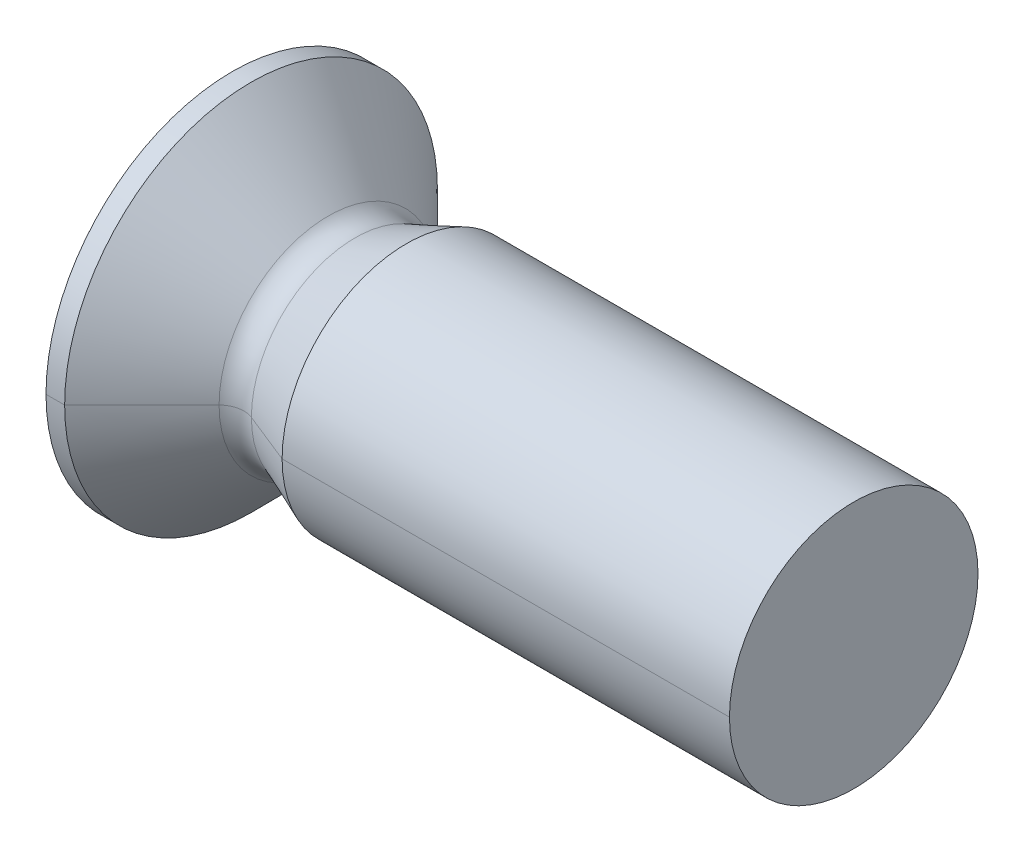
ISO-10303-21;
HEADER;
FILE_DESCRIPTION(('STEP AP214'),'2;1');
FILE_NAME('part.step','',(''),(''),'','','');
FILE_SCHEMA(('AUTOMOTIVE_DESIGN { 1 0 10303 214 1 1 1 1 }'));
ENDSEC;
DATA;
#1=APPLICATION_CONTEXT('core data for automotive mechanical design processes');
#2=APPLICATION_PROTOCOL_DEFINITION('international standard','automotive_design',2000,#1);
#3=PRODUCT_CONTEXT('',#1,'mechanical');
#4=PRODUCT('Part','Part','',(#3));
#5=PRODUCT_RELATED_PRODUCT_CATEGORY('part','',(#4));
#6=PRODUCT_DEFINITION_FORMATION('','',#4);
#7=PRODUCT_DEFINITION_CONTEXT('part definition',#1,'design');
#8=PRODUCT_DEFINITION('design','',#6,#7);
#9=PRODUCT_DEFINITION_SHAPE('','',#8);
#10=(LENGTH_UNIT() NAMED_UNIT(*) SI_UNIT(.MILLI.,.METRE.));
#11=(NAMED_UNIT(*) PLANE_ANGLE_UNIT() SI_UNIT($,.RADIAN.));
#12=(NAMED_UNIT(*) SI_UNIT($,.STERADIAN.) SOLID_ANGLE_UNIT());
#13=UNCERTAINTY_MEASURE_WITH_UNIT(LENGTH_MEASURE(1.E-05),#10,'distance_accuracy_value','');
#14=(GEOMETRIC_REPRESENTATION_CONTEXT(3) GLOBAL_UNCERTAINTY_ASSIGNED_CONTEXT((#13)) GLOBAL_UNIT_ASSIGNED_CONTEXT((#10,
#11,#12)) REPRESENTATION_CONTEXT('',''));
#15=CARTESIAN_POINT('',(0.,0.,0.));
#16=DIRECTION('',(0.,0.,1.));
#17=DIRECTION('',(1.,0.,0.));
#18=AXIS2_PLACEMENT_3D('',#15,#16,#17);
#19=CARTESIAN_POINT('',(-1.4,0.,0.));
#20=DIRECTION('',(1.,0.,0.));
#21=DIRECTION('',(0.,0.,-1.));
#22=AXIS2_PLACEMENT_3D('',#19,#20,#21);
#23=PLANE('',#22);
#24=CARTESIAN_POINT('',(-1.4,0.,0.));
#25=DIRECTION('',(1.,0.,0.));
#26=DIRECTION('',(0.,0.,-1.));
#27=AXIS2_PLACEMENT_3D('',#24,#25,#26);
#28=CIRCLE('',#27,3.);
#29=CARTESIAN_POINT('',(-1.4,0.,-3.));
#30=VERTEX_POINT('',#29);
#31=CARTESIAN_POINT('',(-1.4,0.,3.));
#32=VERTEX_POINT('',#31);
#33=EDGE_CURVE('E11',#30,#32,#28,.T.);
#34=ORIENTED_EDGE('',*,*,#33,.F.);
#35=CARTESIAN_POINT('',(-1.4,0.,0.));
#36=DIRECTION('',(1.,0.,0.));
#37=DIRECTION('',(0.,0.,-1.));
#38=AXIS2_PLACEMENT_3D('',#35,#36,#37);
#39=CIRCLE('',#38,3.);
#40=EDGE_CURVE('E25',#32,#30,#39,.T.);
#41=ORIENTED_EDGE('',*,*,#40,.F.);
#42=EDGE_LOOP('',(#34,#41));
#43=FACE_BOUND('',#42,.T.);
#44=DIRECTION('',(0.,0.,-1.));
#45=VECTOR('',#44,1.);
#46=CARTESIAN_POINT('',(-1.4,-0.4,2.25));
#47=LINE('',#46,#45);
#48=CARTESIAN_POINT('',(-1.4,-0.4,2.25));
#49=VERTEX_POINT('',#48);
#50=CARTESIAN_POINT('',(-1.4,-0.4,1.));
#51=VERTEX_POINT('',#50);
#52=EDGE_CURVE('E523',#49,#51,#47,.T.);
#53=ORIENTED_EDGE('',*,*,#52,.T.);
#54=CARTESIAN_POINT('',(-1.4,-0.999999999999995,0.999999999999995));
#55=DIRECTION('',(1.,0.,0.));
#56=DIRECTION('',(0.,0.,-1.));
#57=AXIS2_PLACEMENT_3D('',#54,#55,#56);
#58=CIRCLE('',#57,0.6);
#59=CARTESIAN_POINT('',(-1.4,-1.,0.4));
#60=VERTEX_POINT('',#59);
#61=EDGE_CURVE('E518',#60,#51,#58,.T.);
#62=ORIENTED_EDGE('',*,*,#61,.F.);
#63=DIRECTION('',(0.,-1.,0.));
#64=VECTOR('',#63,1.);
#65=CARTESIAN_POINT('',(-1.4,-1.,0.4));
#66=LINE('',#65,#64);
#67=CARTESIAN_POINT('',(-1.4,-2.25,0.4));
#68=VERTEX_POINT('',#67);
#69=EDGE_CURVE('E514',#60,#68,#66,.T.);
#70=ORIENTED_EDGE('',*,*,#69,.T.);
#71=DIRECTION('',(0.,0.,-1.));
#72=VECTOR('',#71,1.);
#73=CARTESIAN_POINT('',(-1.4,-2.25,0.4));
#74=LINE('',#73,#72);
#75=CARTESIAN_POINT('',(-1.4,-2.25,-0.4));
#76=VERTEX_POINT('',#75);
#77=EDGE_CURVE('E510',#68,#76,#74,.T.);
#78=ORIENTED_EDGE('',*,*,#77,.T.);
#79=DIRECTION('',(0.,1.,0.));
#80=VECTOR('',#79,1.);
#81=CARTESIAN_POINT('',(-1.4,-2.25,-0.4));
#82=LINE('',#81,#80);
#83=CARTESIAN_POINT('',(-1.4,-1.,-0.4));
#84=VERTEX_POINT('',#83);
#85=EDGE_CURVE('E506',#76,#84,#82,.T.);
#86=ORIENTED_EDGE('',*,*,#85,.T.);
#87=CARTESIAN_POINT('',(-1.4,-0.999999999999995,-0.999999999999995));
#88=DIRECTION('',(1.,0.,0.));
#89=DIRECTION('',(0.,0.,-1.));
#90=AXIS2_PLACEMENT_3D('',#87,#88,#89);
#91=CIRCLE('',#90,0.6);
#92=CARTESIAN_POINT('',(-1.4,-0.4,-1.));
#93=VERTEX_POINT('',#92);
#94=EDGE_CURVE('E501',#93,#84,#91,.T.);
#95=ORIENTED_EDGE('',*,*,#94,.F.);
#96=DIRECTION('',(0.,0.,-1.));
#97=VECTOR('',#96,1.);
#98=CARTESIAN_POINT('',(-1.4,-0.4,-1.));
#99=LINE('',#98,#97);
#100=CARTESIAN_POINT('',(-1.4,-0.4,-2.25));
#101=VERTEX_POINT('',#100);
#102=EDGE_CURVE('E497',#93,#101,#99,.T.);
#103=ORIENTED_EDGE('',*,*,#102,.T.);
#104=DIRECTION('',(0.,1.,0.));
#105=VECTOR('',#104,1.);
#106=CARTESIAN_POINT('',(-1.4,-0.4,-2.25));
#107=LINE('',#106,#105);
#108=CARTESIAN_POINT('',(-1.4,0.4,-2.25));
#109=VERTEX_POINT('',#108);
#110=EDGE_CURVE('E493',#101,#109,#107,.T.);
#111=ORIENTED_EDGE('',*,*,#110,.T.);
#112=DIRECTION('',(0.,0.,1.));
#113=VECTOR('',#112,1.);
#114=CARTESIAN_POINT('',(-1.4,0.4,-2.25));
#115=LINE('',#114,#113);
#116=CARTESIAN_POINT('',(-1.4,0.4,-1.));
#117=VERTEX_POINT('',#116);
#118=EDGE_CURVE('E489',#109,#117,#115,.T.);
#119=ORIENTED_EDGE('',*,*,#118,.T.);
#120=CARTESIAN_POINT('',(-1.4,0.999999999999995,-0.999999999999995));
#121=DIRECTION('',(1.,0.,0.));
#122=DIRECTION('',(0.,0.,-1.));
#123=AXIS2_PLACEMENT_3D('',#120,#121,#122);
#124=CIRCLE('',#123,0.6);
#125=CARTESIAN_POINT('',(-1.4,1.,-0.4));
#126=VERTEX_POINT('',#125);
#127=EDGE_CURVE('E484',#126,#117,#124,.T.);
#128=ORIENTED_EDGE('',*,*,#127,.F.);
#129=DIRECTION('',(0.,1.,0.));
#130=VECTOR('',#129,1.);
#131=CARTESIAN_POINT('',(-1.4,1.,-0.4));
#132=LINE('',#131,#130);
#133=CARTESIAN_POINT('',(-1.4,2.25,-0.4));
#134=VERTEX_POINT('',#133);
#135=EDGE_CURVE('E480',#126,#134,#132,.T.);
#136=ORIENTED_EDGE('',*,*,#135,.T.);
#137=DIRECTION('',(0.,0.,-1.));
#138=VECTOR('',#137,1.);
#139=CARTESIAN_POINT('',(-1.4,2.25,0.));
#140=LINE('',#139,#138);
#141=CARTESIAN_POINT('',(-1.4,2.25,0.4));
#142=VERTEX_POINT('',#141);
#143=EDGE_CURVE('E475',#142,#134,#140,.T.);
#144=ORIENTED_EDGE('',*,*,#143,.F.);
#145=DIRECTION('',(0.,-1.,0.));
#146=VECTOR('',#145,1.);
#147=CARTESIAN_POINT('',(-1.4,2.25,0.4));
#148=LINE('',#147,#146);
#149=CARTESIAN_POINT('',(-1.4,1.,0.4));
#150=VERTEX_POINT('',#149);
#151=EDGE_CURVE('E471',#142,#150,#148,.T.);
#152=ORIENTED_EDGE('',*,*,#151,.T.);
#153=CARTESIAN_POINT('',(-1.4,0.999999999999995,0.999999999999995));
#154=DIRECTION('',(1.,0.,0.));
#155=DIRECTION('',(0.,0.,-1.));
#156=AXIS2_PLACEMENT_3D('',#153,#154,#155);
#157=CIRCLE('',#156,0.6);
#158=CARTESIAN_POINT('',(-1.4,0.4,1.));
#159=VERTEX_POINT('',#158);
#160=EDGE_CURVE('E466',#159,#150,#157,.T.);
#161=ORIENTED_EDGE('',*,*,#160,.F.);
#162=DIRECTION('',(0.,0.,1.));
#163=VECTOR('',#162,1.);
#164=CARTESIAN_POINT('',(-1.4,0.4,1.));
#165=LINE('',#164,#163);
#166=CARTESIAN_POINT('',(-1.4,0.4,2.25));
#167=VERTEX_POINT('',#166);
#168=EDGE_CURVE('E462',#159,#167,#165,.T.);
#169=ORIENTED_EDGE('',*,*,#168,.T.);
#170=DIRECTION('',(0.,-1.,0.));
#171=VECTOR('',#170,1.);
#172=CARTESIAN_POINT('',(-1.4,0.4,2.25));
#173=LINE('',#172,#171);
#174=EDGE_CURVE('E458',#167,#49,#173,.T.);
#175=ORIENTED_EDGE('',*,*,#174,.T.);
#176=EDGE_LOOP('',(#53,#62,#70,#78,#86,#95,#103,#111,#119,#128,#136,#144,#152,#161,#169,#175));
#177=FACE_BOUND('',#176,.T.);
#178=ADVANCED_FACE('F17',(#43,#177),#23,.F.);
#179=CARTESIAN_POINT('',(-0.7,0.4,2.25));
#180=DIRECTION('',(0.,0.,-1.));
#181=DIRECTION('',(-1.,0.,0.));
#182=AXIS2_PLACEMENT_3D('',#179,#180,#181);
#183=PLANE('',#182);
#184=ORIENTED_EDGE('',*,*,#174,.F.);
#185=DIRECTION('',(-1.,0.,0.));
#186=VECTOR('',#185,1.);
#187=CARTESIAN_POINT('',(-0.7,0.4,2.25));
#188=LINE('',#187,#186);
#189=CARTESIAN_POINT('',(-0.7,0.4,2.25));
#190=VERTEX_POINT('',#189);
#191=EDGE_CURVE('E453',#190,#167,#188,.T.);
#192=ORIENTED_EDGE('',*,*,#191,.F.);
#193=DIRECTION('',(0.,-1.,0.));
#194=VECTOR('',#193,1.);
#195=CARTESIAN_POINT('',(-0.7,0.4,2.25));
#196=LINE('',#195,#194);
#197=CARTESIAN_POINT('',(-0.7,-0.4,2.25));
#198=VERTEX_POINT('',#197);
#199=EDGE_CURVE('E449',#190,#198,#196,.T.);
#200=ORIENTED_EDGE('',*,*,#199,.T.);
#201=DIRECTION('',(-1.,0.,0.));
#202=VECTOR('',#201,1.);
#203=CARTESIAN_POINT('',(-0.7,-0.4,2.25));
#204=LINE('',#203,#202);
#205=EDGE_CURVE('E444',#198,#49,#204,.T.);
#206=ORIENTED_EDGE('',*,*,#205,.T.);
#207=EDGE_LOOP('',(#184,#192,#200,#206));
#208=FACE_BOUND('',#207,.T.);
#209=ADVANCED_FACE('F557',(#208),#183,.T.);
#210=CARTESIAN_POINT('',(-0.7,-0.4,2.25));
#211=DIRECTION('',(0.,1.,0.));
#212=DIRECTION('',(0.,0.,1.));
#213=AXIS2_PLACEMENT_3D('',#210,#211,#212);
#214=PLANE('',#213);
#215=ORIENTED_EDGE('',*,*,#52,.F.);
#216=ORIENTED_EDGE('',*,*,#205,.F.);
#217=DIRECTION('',(0.,0.,-1.));
#218=VECTOR('',#217,1.);
#219=CARTESIAN_POINT('',(-0.7,-0.4,2.25));
#220=LINE('',#219,#218);
#221=CARTESIAN_POINT('',(-0.7,-0.4,1.));
#222=VERTEX_POINT('',#221);
#223=EDGE_CURVE('E440',#198,#222,#220,.T.);
#224=ORIENTED_EDGE('',*,*,#223,.T.);
#225=DIRECTION('',(-1.,0.,0.));
#226=VECTOR('',#225,1.);
#227=CARTESIAN_POINT('',(-0.7,-0.4,1.));
#228=LINE('',#227,#226);
#229=EDGE_CURVE('E435',#222,#51,#228,.T.);
#230=ORIENTED_EDGE('',*,*,#229,.T.);
#231=EDGE_LOOP('',(#215,#216,#224,#230));
#232=FACE_BOUND('',#231,.T.);
#233=ADVANCED_FACE('F561',(#232),#214,.T.);
#234=CARTESIAN_POINT('',(-0.7,-0.999999999999995,0.999999999999995));
#235=DIRECTION('',(1.,0.,0.));
#236=DIRECTION('',(0.,-0.707106781186548,0.707106781186547));
#237=AXIS2_PLACEMENT_3D('',#234,#235,#236);
#238=CYLINDRICAL_SURFACE('',#237,0.6);
#239=ORIENTED_EDGE('',*,*,#61,.T.);
#240=ORIENTED_EDGE('',*,*,#229,.F.);
#241=CARTESIAN_POINT('',(-0.7,-0.999999999999995,0.999999999999995));
#242=DIRECTION('',(1.,0.,0.));
#243=DIRECTION('',(0.,0.,-1.));
#244=AXIS2_PLACEMENT_3D('',#241,#242,#243);
#245=CIRCLE('',#244,0.6);
#246=CARTESIAN_POINT('',(-0.7,-1.,0.4));
#247=VERTEX_POINT('',#246);
#248=EDGE_CURVE('E430',#247,#222,#245,.T.);
#249=ORIENTED_EDGE('',*,*,#248,.F.);
#250=DIRECTION('',(-1.,0.,0.));
#251=VECTOR('',#250,1.);
#252=CARTESIAN_POINT('',(-0.7,-1.,0.4));
#253=LINE('',#252,#251);
#254=EDGE_CURVE('E425',#247,#60,#253,.T.);
#255=ORIENTED_EDGE('',*,*,#254,.T.);
#256=EDGE_LOOP('',(#239,#240,#249,#255));
#257=FACE_BOUND('',#256,.T.);
#258=ADVANCED_FACE('F571',(#257),#238,.T.);
#259=CARTESIAN_POINT('',(-0.7,-1.,0.4));
#260=DIRECTION('',(0.,0.,-1.));
#261=DIRECTION('',(-1.,0.,0.));
#262=AXIS2_PLACEMENT_3D('',#259,#260,#261);
#263=PLANE('',#262);
#264=ORIENTED_EDGE('',*,*,#69,.F.);
#265=ORIENTED_EDGE('',*,*,#254,.F.);
#266=DIRECTION('',(0.,-1.,0.));
#267=VECTOR('',#266,1.);
#268=CARTESIAN_POINT('',(-0.7,-1.,0.4));
#269=LINE('',#268,#267);
#270=CARTESIAN_POINT('',(-0.7,-2.25,0.4));
#271=VERTEX_POINT('',#270);
#272=EDGE_CURVE('E421',#247,#271,#269,.T.);
#273=ORIENTED_EDGE('',*,*,#272,.T.);
#274=DIRECTION('',(-1.,0.,0.));
#275=VECTOR('',#274,1.);
#276=CARTESIAN_POINT('',(-0.7,-2.25,0.4));
#277=LINE('',#276,#275);
#278=EDGE_CURVE('E416',#271,#68,#277,.T.);
#279=ORIENTED_EDGE('',*,*,#278,.T.);
#280=EDGE_LOOP('',(#264,#265,#273,#279));
#281=FACE_BOUND('',#280,.T.);
#282=ADVANCED_FACE('F576',(#281),#263,.T.);
#283=CARTESIAN_POINT('',(-0.7,-2.25,0.4));
#284=DIRECTION('',(0.,1.,0.));
#285=DIRECTION('',(0.,0.,1.));
#286=AXIS2_PLACEMENT_3D('',#283,#284,#285);
#287=PLANE('',#286);
#288=ORIENTED_EDGE('',*,*,#77,.F.);
#289=ORIENTED_EDGE('',*,*,#278,.F.);
#290=DIRECTION('',(0.,0.,-1.));
#291=VECTOR('',#290,1.);
#292=CARTESIAN_POINT('',(-0.7,-2.25,0.4));
#293=LINE('',#292,#291);
#294=CARTESIAN_POINT('',(-0.7,-2.25,-0.4));
#295=VERTEX_POINT('',#294);
#296=EDGE_CURVE('E412',#271,#295,#293,.T.);
#297=ORIENTED_EDGE('',*,*,#296,.T.);
#298=DIRECTION('',(-1.,0.,0.));
#299=VECTOR('',#298,1.);
#300=CARTESIAN_POINT('',(-0.7,-2.25,-0.4));
#301=LINE('',#300,#299);
#302=EDGE_CURVE('E407',#295,#76,#301,.T.);
#303=ORIENTED_EDGE('',*,*,#302,.T.);
#304=EDGE_LOOP('',(#288,#289,#297,#303));
#305=FACE_BOUND('',#304,.T.);
#306=ADVANCED_FACE('F582',(#305),#287,.T.);
#307=CARTESIAN_POINT('',(-0.7,-2.25,-0.4));
#308=DIRECTION('',(0.,0.,1.));
#309=DIRECTION('',(1.,0.,0.));
#310=AXIS2_PLACEMENT_3D('',#307,#308,#309);
#311=PLANE('',#310);
#312=ORIENTED_EDGE('',*,*,#85,.F.);
#313=ORIENTED_EDGE('',*,*,#302,.F.);
#314=DIRECTION('',(0.,1.,0.));
#315=VECTOR('',#314,1.);
#316=CARTESIAN_POINT('',(-0.7,-2.25,-0.4));
#317=LINE('',#316,#315);
#318=CARTESIAN_POINT('',(-0.7,-1.,-0.4));
#319=VERTEX_POINT('',#318);
#320=EDGE_CURVE('E403',#295,#319,#317,.T.);
#321=ORIENTED_EDGE('',*,*,#320,.T.);
#322=DIRECTION('',(-1.,0.,0.));
#323=VECTOR('',#322,1.);
#324=CARTESIAN_POINT('',(-0.7,-1.,-0.4));
#325=LINE('',#324,#323);
#326=EDGE_CURVE('E398',#319,#84,#325,.T.);
#327=ORIENTED_EDGE('',*,*,#326,.T.);
#328=EDGE_LOOP('',(#312,#313,#321,#327));
#329=FACE_BOUND('',#328,.T.);
#330=ADVANCED_FACE('F586',(#329),#311,.T.);
#331=CARTESIAN_POINT('',(-0.7,-0.999999999999995,-0.999999999999995));
#332=DIRECTION('',(1.,0.,0.));
#333=DIRECTION('',(0.,-0.707106781186548,-0.707106781186547));
#334=AXIS2_PLACEMENT_3D('',#331,#332,#333);
#335=CYLINDRICAL_SURFACE('',#334,0.6);
#336=ORIENTED_EDGE('',*,*,#94,.T.);
#337=ORIENTED_EDGE('',*,*,#326,.F.);
#338=CARTESIAN_POINT('',(-0.7,-0.999999999999995,-0.999999999999995));
#339=DIRECTION('',(1.,0.,0.));
#340=DIRECTION('',(0.,0.,-1.));
#341=AXIS2_PLACEMENT_3D('',#338,#339,#340);
#342=CIRCLE('',#341,0.6);
#343=CARTESIAN_POINT('',(-0.7,-0.4,-1.));
#344=VERTEX_POINT('',#343);
#345=EDGE_CURVE('E393',#344,#319,#342,.T.);
#346=ORIENTED_EDGE('',*,*,#345,.F.);
#347=DIRECTION('',(-1.,0.,0.));
#348=VECTOR('',#347,1.);
#349=CARTESIAN_POINT('',(-0.7,-0.4,-1.));
#350=LINE('',#349,#348);
#351=EDGE_CURVE('E388',#344,#93,#350,.T.);
#352=ORIENTED_EDGE('',*,*,#351,.T.);
#353=EDGE_LOOP('',(#336,#337,#346,#352));
#354=FACE_BOUND('',#353,.T.);
#355=ADVANCED_FACE('F589',(#354),#335,.T.);
#356=CARTESIAN_POINT('',(-0.7,-0.4,-1.));
#357=DIRECTION('',(0.,1.,0.));
#358=DIRECTION('',(0.,0.,1.));
#359=AXIS2_PLACEMENT_3D('',#356,#357,#358);
#360=PLANE('',#359);
#361=ORIENTED_EDGE('',*,*,#102,.F.);
#362=ORIENTED_EDGE('',*,*,#351,.F.);
#363=DIRECTION('',(0.,0.,-1.));
#364=VECTOR('',#363,1.);
#365=CARTESIAN_POINT('',(-0.7,-0.4,-1.));
#366=LINE('',#365,#364);
#367=CARTESIAN_POINT('',(-0.7,-0.4,-2.25));
#368=VERTEX_POINT('',#367);
#369=EDGE_CURVE('E384',#344,#368,#366,.T.);
#370=ORIENTED_EDGE('',*,*,#369,.T.);
#371=DIRECTION('',(-1.,0.,0.));
#372=VECTOR('',#371,1.);
#373=CARTESIAN_POINT('',(-0.7,-0.4,-2.25));
#374=LINE('',#373,#372);
#375=EDGE_CURVE('E379',#368,#101,#374,.T.);
#376=ORIENTED_EDGE('',*,*,#375,.T.);
#377=EDGE_LOOP('',(#361,#362,#370,#376));
#378=FACE_BOUND('',#377,.T.);
#379=ADVANCED_FACE('F595',(#378),#360,.T.);
#380=CARTESIAN_POINT('',(-0.7,-0.4,-2.25));
#381=DIRECTION('',(0.,0.,1.));
#382=DIRECTION('',(1.,0.,0.));
#383=AXIS2_PLACEMENT_3D('',#380,#381,#382);
#384=PLANE('',#383);
#385=ORIENTED_EDGE('',*,*,#110,.F.);
#386=ORIENTED_EDGE('',*,*,#375,.F.);
#387=DIRECTION('',(0.,1.,0.));
#388=VECTOR('',#387,1.);
#389=CARTESIAN_POINT('',(-0.7,-0.4,-2.25));
#390=LINE('',#389,#388);
#391=CARTESIAN_POINT('',(-0.7,0.4,-2.25));
#392=VERTEX_POINT('',#391);
#393=EDGE_CURVE('E375',#368,#392,#390,.T.);
#394=ORIENTED_EDGE('',*,*,#393,.T.);
#395=DIRECTION('',(-1.,0.,0.));
#396=VECTOR('',#395,1.);
#397=CARTESIAN_POINT('',(-0.7,0.4,-2.25));
#398=LINE('',#397,#396);
#399=EDGE_CURVE('E370',#392,#109,#398,.T.);
#400=ORIENTED_EDGE('',*,*,#399,.T.);
#401=EDGE_LOOP('',(#385,#386,#394,#400));
#402=FACE_BOUND('',#401,.T.);
#403=ADVANCED_FACE('F599',(#402),#384,.T.);
#404=CARTESIAN_POINT('',(-0.7,0.4,-2.25));
#405=DIRECTION('',(0.,-1.,0.));
#406=DIRECTION('',(0.,0.,-1.));
#407=AXIS2_PLACEMENT_3D('',#404,#405,#406);
#408=PLANE('',#407);
#409=ORIENTED_EDGE('',*,*,#118,.F.);
#410=ORIENTED_EDGE('',*,*,#399,.F.);
#411=DIRECTION('',(0.,0.,1.));
#412=VECTOR('',#411,1.);
#413=CARTESIAN_POINT('',(-0.7,0.4,-2.25));
#414=LINE('',#413,#412);
#415=CARTESIAN_POINT('',(-0.7,0.4,-1.));
#416=VERTEX_POINT('',#415);
#417=EDGE_CURVE('E366',#392,#416,#414,.T.);
#418=ORIENTED_EDGE('',*,*,#417,.T.);
#419=DIRECTION('',(-1.,0.,0.));
#420=VECTOR('',#419,1.);
#421=CARTESIAN_POINT('',(-0.7,0.4,-1.));
#422=LINE('',#421,#420);
#423=EDGE_CURVE('E361',#416,#117,#422,.T.);
#424=ORIENTED_EDGE('',*,*,#423,.T.);
#425=EDGE_LOOP('',(#409,#410,#418,#424));
#426=FACE_BOUND('',#425,.T.);
#427=ADVANCED_FACE('F604',(#426),#408,.T.);
#428=CARTESIAN_POINT('',(-0.7,0.999999999999995,-0.999999999999995));
#429=DIRECTION('',(1.,0.,0.));
#430=DIRECTION('',(0.,0.707106781186553,-0.707106781186542));
#431=AXIS2_PLACEMENT_3D('',#428,#429,#430);
#432=CYLINDRICAL_SURFACE('',#431,0.6);
#433=ORIENTED_EDGE('',*,*,#127,.T.);
#434=ORIENTED_EDGE('',*,*,#423,.F.);
#435=CARTESIAN_POINT('',(-0.7,0.999999999999995,-0.999999999999995));
#436=DIRECTION('',(1.,0.,0.));
#437=DIRECTION('',(0.,0.,-1.));
#438=AXIS2_PLACEMENT_3D('',#435,#436,#437);
#439=CIRCLE('',#438,0.6);
#440=CARTESIAN_POINT('',(-0.7,1.,-0.4));
#441=VERTEX_POINT('',#440);
#442=EDGE_CURVE('E356',#441,#416,#439,.T.);
#443=ORIENTED_EDGE('',*,*,#442,.F.);
#444=DIRECTION('',(-1.,0.,0.));
#445=VECTOR('',#444,1.);
#446=CARTESIAN_POINT('',(-0.7,1.,-0.4));
#447=LINE('',#446,#445);
#448=EDGE_CURVE('E351',#441,#126,#447,.T.);
#449=ORIENTED_EDGE('',*,*,#448,.T.);
#450=EDGE_LOOP('',(#433,#434,#443,#449));
#451=FACE_BOUND('',#450,.T.);
#452=ADVANCED_FACE('F609',(#451),#432,.T.);
#453=CARTESIAN_POINT('',(-0.7,1.,-0.4));
#454=DIRECTION('',(0.,0.,1.));
#455=DIRECTION('',(1.,0.,0.));
#456=AXIS2_PLACEMENT_3D('',#453,#454,#455);
#457=PLANE('',#456);
#458=ORIENTED_EDGE('',*,*,#135,.F.);
#459=ORIENTED_EDGE('',*,*,#448,.F.);
#460=DIRECTION('',(0.,1.,0.));
#461=VECTOR('',#460,1.);
#462=CARTESIAN_POINT('',(-0.7,1.,-0.4));
#463=LINE('',#462,#461);
#464=CARTESIAN_POINT('',(-0.7,2.25,-0.4));
#465=VERTEX_POINT('',#464);
#466=EDGE_CURVE('E347',#441,#465,#463,.T.);
#467=ORIENTED_EDGE('',*,*,#466,.T.);
#468=DIRECTION('',(-1.,0.,0.));
#469=VECTOR('',#468,1.);
#470=CARTESIAN_POINT('',(-0.7,2.25,-0.4));
#471=LINE('',#470,#469);
#472=EDGE_CURVE('E342',#465,#134,#471,.T.);
#473=ORIENTED_EDGE('',*,*,#472,.T.);
#474=EDGE_LOOP('',(#458,#459,#467,#473));
#475=FACE_BOUND('',#474,.T.);
#476=ADVANCED_FACE('F612',(#475),#457,.T.);
#477=CARTESIAN_POINT('',(-0.7,2.25,-0.4));
#478=DIRECTION('',(0.,-1.,0.));
#479=DIRECTION('',(0.,0.,-1.));
#480=AXIS2_PLACEMENT_3D('',#477,#478,#479);
#481=PLANE('',#480);
#482=ORIENTED_EDGE('',*,*,#143,.T.);
#483=ORIENTED_EDGE('',*,*,#472,.F.);
#484=DIRECTION('',(0.,0.,1.));
#485=VECTOR('',#484,1.);
#486=CARTESIAN_POINT('',(-0.7,2.25,-0.4));
#487=LINE('',#486,#485);
#488=CARTESIAN_POINT('',(-0.7,2.25,0.4));
#489=VERTEX_POINT('',#488);
#490=EDGE_CURVE('E338',#465,#489,#487,.T.);
#491=ORIENTED_EDGE('',*,*,#490,.T.);
#492=DIRECTION('',(-1.,0.,0.));
#493=VECTOR('',#492,1.);
#494=CARTESIAN_POINT('',(-0.7,2.25,0.4));
#495=LINE('',#494,#493);
#496=EDGE_CURVE('E333',#489,#142,#495,.T.);
#497=ORIENTED_EDGE('',*,*,#496,.T.);
#498=EDGE_LOOP('',(#482,#483,#491,#497));
#499=FACE_BOUND('',#498,.T.);
#500=ADVANCED_FACE('F616',(#499),#481,.T.);
#501=CARTESIAN_POINT('',(-0.7,2.25,0.4));
#502=DIRECTION('',(0.,0.,-1.));
#503=DIRECTION('',(-1.,0.,0.));
#504=AXIS2_PLACEMENT_3D('',#501,#502,#503);
#505=PLANE('',#504);
#506=ORIENTED_EDGE('',*,*,#151,.F.);
#507=ORIENTED_EDGE('',*,*,#496,.F.);
#508=DIRECTION('',(0.,-1.,0.));
#509=VECTOR('',#508,1.);
#510=CARTESIAN_POINT('',(-0.7,2.25,0.4));
#511=LINE('',#510,#509);
#512=CARTESIAN_POINT('',(-0.7,1.,0.4));
#513=VERTEX_POINT('',#512);
#514=EDGE_CURVE('E329',#489,#513,#511,.T.);
#515=ORIENTED_EDGE('',*,*,#514,.T.);
#516=DIRECTION('',(-1.,0.,0.));
#517=VECTOR('',#516,1.);
#518=CARTESIAN_POINT('',(-0.7,1.,0.4));
#519=LINE('',#518,#517);
#520=EDGE_CURVE('E324',#513,#150,#519,.T.);
#521=ORIENTED_EDGE('',*,*,#520,.T.);
#522=EDGE_LOOP('',(#506,#507,#515,#521));
#523=FACE_BOUND('',#522,.T.);
#524=ADVANCED_FACE('F621',(#523),#505,.T.);
#525=CARTESIAN_POINT('',(-0.7,0.999999999999995,0.999999999999995));
#526=DIRECTION('',(1.,0.,0.));
#527=DIRECTION('',(0.,0.707106781186548,0.707106781186547));
#528=AXIS2_PLACEMENT_3D('',#525,#526,#527);
#529=CYLINDRICAL_SURFACE('',#528,0.6);
#530=ORIENTED_EDGE('',*,*,#160,.T.);
#531=ORIENTED_EDGE('',*,*,#520,.F.);
#532=CARTESIAN_POINT('',(-0.7,0.999999999999995,0.999999999999995));
#533=DIRECTION('',(1.,0.,0.));
#534=DIRECTION('',(0.,0.,-1.));
#535=AXIS2_PLACEMENT_3D('',#532,#533,#534);
#536=CIRCLE('',#535,0.6);
#537=CARTESIAN_POINT('',(-0.7,0.4,1.));
#538=VERTEX_POINT('',#537);
#539=EDGE_CURVE('E319',#538,#513,#536,.T.);
#540=ORIENTED_EDGE('',*,*,#539,.F.);
#541=DIRECTION('',(-1.,0.,0.));
#542=VECTOR('',#541,1.);
#543=CARTESIAN_POINT('',(-0.7,0.4,1.));
#544=LINE('',#543,#542);
#545=EDGE_CURVE('E314',#538,#159,#544,.T.);
#546=ORIENTED_EDGE('',*,*,#545,.T.);
#547=EDGE_LOOP('',(#530,#531,#540,#546));
#548=FACE_BOUND('',#547,.T.);
#549=ADVANCED_FACE('F624',(#548),#529,.T.);
#550=CARTESIAN_POINT('',(-0.7,0.4,1.));
#551=DIRECTION('',(0.,-1.,0.));
#552=DIRECTION('',(0.,0.,-1.));
#553=AXIS2_PLACEMENT_3D('',#550,#551,#552);
#554=PLANE('',#553);
#555=ORIENTED_EDGE('',*,*,#168,.F.);
#556=ORIENTED_EDGE('',*,*,#545,.F.);
#557=DIRECTION('',(0.,0.,1.));
#558=VECTOR('',#557,1.);
#559=CARTESIAN_POINT('',(-0.7,0.4,1.));
#560=LINE('',#559,#558);
#561=EDGE_CURVE('E309',#538,#190,#560,.T.);
#562=ORIENTED_EDGE('',*,*,#561,.T.);
#563=ORIENTED_EDGE('',*,*,#191,.T.);
#564=EDGE_LOOP('',(#555,#556,#562,#563));
#565=FACE_BOUND('',#564,.T.);
#566=ADVANCED_FACE('F629',(#565),#554,.T.);
#567=CARTESIAN_POINT('',(-0.7,-0.999999999999995,0.999999999999995));
#568=DIRECTION('',(1.,0.,0.));
#569=DIRECTION('',(0.,0.,-1.));
#570=AXIS2_PLACEMENT_3D('',#567,#568,#569);
#571=PLANE('',#570);
#572=ORIENTED_EDGE('',*,*,#199,.F.);
#573=ORIENTED_EDGE('',*,*,#561,.F.);
#574=ORIENTED_EDGE('',*,*,#539,.T.);
#575=ORIENTED_EDGE('',*,*,#514,.F.);
#576=ORIENTED_EDGE('',*,*,#490,.F.);
#577=ORIENTED_EDGE('',*,*,#466,.F.);
#578=ORIENTED_EDGE('',*,*,#442,.T.);
#579=ORIENTED_EDGE('',*,*,#417,.F.);
#580=ORIENTED_EDGE('',*,*,#393,.F.);
#581=ORIENTED_EDGE('',*,*,#369,.F.);
#582=ORIENTED_EDGE('',*,*,#345,.T.);
#583=ORIENTED_EDGE('',*,*,#320,.F.);
#584=ORIENTED_EDGE('',*,*,#296,.F.);
#585=ORIENTED_EDGE('',*,*,#272,.F.);
#586=ORIENTED_EDGE('',*,*,#248,.T.);
#587=ORIENTED_EDGE('',*,*,#223,.F.);
#588=EDGE_LOOP('',(#572,#573,#574,#575,#576,#577,#578,#579,#580,#581,#582,#583,#584,#585,#586,#587));
#589=FACE_BOUND('',#588,.T.);
#590=ADVANCED_FACE('F632',(#589),#571,.F.);
#591=CARTESIAN_POINT('',(8.6,0.,0.));
#592=DIRECTION('',(-1.,0.,0.));
#593=DIRECTION('',(0.,1.,0.));
#594=AXIS2_PLACEMENT_3D('',#591,#592,#593);
#595=CYLINDRICAL_SURFACE('',#594,3.);
#596=ORIENTED_EDGE('',*,*,#40,.T.);
#597=DIRECTION('',(-1.,0.,0.));
#598=VECTOR('',#597,1.);
#599=CARTESIAN_POINT('',(-1.1,0.,-3.));
#600=LINE('',#599,#598);
#601=CARTESIAN_POINT('',(-1.1,0.,-3.));
#602=VERTEX_POINT('',#601);
#603=EDGE_CURVE('E304',#602,#30,#600,.T.);
#604=ORIENTED_EDGE('',*,*,#603,.F.);
#605=CARTESIAN_POINT('',(-1.1,0.,0.));
#606=DIRECTION('',(1.,0.,0.));
#607=DIRECTION('',(0.,0.,-1.));
#608=AXIS2_PLACEMENT_3D('',#605,#606,#607);
#609=CIRCLE('',#608,3.);
#610=CARTESIAN_POINT('',(-1.1,0.,3.));
#611=VERTEX_POINT('',#610);
#612=EDGE_CURVE('E299',#611,#602,#609,.T.);
#613=ORIENTED_EDGE('',*,*,#612,.F.);
#614=DIRECTION('',(-1.,0.,0.));
#615=VECTOR('',#614,1.);
#616=CARTESIAN_POINT('',(-1.1,0.,3.));
#617=LINE('',#616,#615);
#618=EDGE_CURVE('E295',#611,#32,#617,.T.);
#619=ORIENTED_EDGE('',*,*,#618,.T.);
#620=EDGE_LOOP('',(#596,#604,#613,#619));
#621=FACE_BOUND('',#620,.T.);
#622=ADVANCED_FACE('F532',(#621),#595,.T.);
#623=CARTESIAN_POINT('',(8.6,0.,0.));
#624=DIRECTION('',(-1.,0.,0.));
#625=DIRECTION('',(0.,-1.,0.));
#626=AXIS2_PLACEMENT_3D('',#623,#624,#625);
#627=CYLINDRICAL_SURFACE('',#626,3.);
#628=CARTESIAN_POINT('',(-1.1,0.,0.));
#629=DIRECTION('',(1.,0.,0.));
#630=DIRECTION('',(0.,0.,-1.));
#631=AXIS2_PLACEMENT_3D('',#628,#629,#630);
#632=CIRCLE('',#631,3.);
#633=EDGE_CURVE('E290',#602,#611,#632,.T.);
#634=ORIENTED_EDGE('',*,*,#633,.F.);
#635=ORIENTED_EDGE('',*,*,#603,.T.);
#636=ORIENTED_EDGE('',*,*,#33,.T.);
#637=ORIENTED_EDGE('',*,*,#618,.F.);
#638=EDGE_LOOP('',(#634,#635,#636,#637));
#639=FACE_BOUND('',#638,.T.);
#640=ADVANCED_FACE('F536',(#639),#627,.T.);
#641=CARTESIAN_POINT('',(-1.1,0.,0.));
#642=DIRECTION('',(-1.,0.,0.));
#643=DIRECTION('',(0.,-1.,0.));
#644=AXIS2_PLACEMENT_3D('',#641,#642,#643);
#645=CONICAL_SURFACE('',#644,3.,0.7853981634);
#646=CARTESIAN_POINT('',(0.142782192563589,0.,0.));
#647=DIRECTION('',(1.,0.,0.));
#648=DIRECTION('',(0.,0.,-1.));
#649=AXIS2_PLACEMENT_3D('',#646,#647,#648);
#650=CIRCLE('',#649,1.7572178074);
#651=CARTESIAN_POINT('',(0.142782192563589,0.,-1.7572178074364));
#652=VERTEX_POINT('',#651);
#653=CARTESIAN_POINT('',(0.142782192576267,0.,1.75721780741268));
#654=VERTEX_POINT('',#653);
#655=EDGE_CURVE('E286',#652,#654,#650,.T.);
#656=ORIENTED_EDGE('',*,*,#655,.F.);
#657=DIRECTION('',(-0.707106781184743,0.,-0.707106781188352));
#658=VECTOR('',#657,1.);
#659=CARTESIAN_POINT('',(0.142782192578623,0.,-1.75721780741503));
#660=LINE('',#659,#658);
#661=EDGE_CURVE('E281',#652,#602,#660,.T.);
#662=ORIENTED_EDGE('',*,*,#661,.T.);
#663=ORIENTED_EDGE('',*,*,#633,.T.);
#664=DIRECTION('',(-0.707106781184743,0.,0.707106781188352));
#665=VECTOR('',#664,1.);
#666=CARTESIAN_POINT('',(0.142782192578623,0.,1.75721780741503));
#667=LINE('',#666,#665);
#668=EDGE_CURVE('E276',#654,#611,#667,.T.);
#669=ORIENTED_EDGE('',*,*,#668,.F.);
#670=EDGE_LOOP('',(#656,#662,#663,#669));
#671=FACE_BOUND('',#670,.T.);
#672=ADVANCED_FACE('F539',(#671),#645,.T.);
#673=CARTESIAN_POINT('',(-1.1,0.,0.));
#674=DIRECTION('',(-1.,0.,0.));
#675=DIRECTION('',(0.,1.,0.));
#676=AXIS2_PLACEMENT_3D('',#673,#674,#675);
#677=CONICAL_SURFACE('',#676,3.,0.7853981634);
#678=ORIENTED_EDGE('',*,*,#612,.T.);
#679=ORIENTED_EDGE('',*,*,#661,.F.);
#680=CARTESIAN_POINT('',(0.142782192563589,0.,0.));
#681=DIRECTION('',(1.,0.,0.));
#682=DIRECTION('',(0.,0.,-1.));
#683=AXIS2_PLACEMENT_3D('',#680,#681,#682);
#684=CIRCLE('',#683,1.7572178074);
#685=EDGE_CURVE('E272',#654,#652,#684,.T.);
#686=ORIENTED_EDGE('',*,*,#685,.F.);
#687=ORIENTED_EDGE('',*,*,#668,.T.);
#688=EDGE_LOOP('',(#678,#679,#686,#687));
#689=FACE_BOUND('',#688,.T.);
#690=ADVANCED_FACE('F542',(#689),#677,.T.);
#691=CARTESIAN_POINT('',(0.425624905038184,0.,0.));
#692=DIRECTION('',(1.,0.,0.));
#693=DIRECTION('',(0.,1.,0.));
#694=AXIS2_PLACEMENT_3D('',#691,#692,#693);
#695=TOROIDAL_SURFACE('',#694,2.0400605199,0.4);
#696=CARTESIAN_POINT('',(0.57456973435672,0.,0.));
#697=DIRECTION('',(1.,0.,0.));
#698=DIRECTION('',(0.,0.,-1.));
#699=AXIS2_PLACEMENT_3D('',#696,#697,#698);
#700=CIRCLE('',#699,1.6688255029);
#701=CARTESIAN_POINT('',(0.57456973435672,0.,1.6688255029));
#702=VERTEX_POINT('',#701);
#703=CARTESIAN_POINT('',(0.57456973435672,0.,-1.6688255029484));
#704=VERTEX_POINT('',#703);
#705=EDGE_CURVE('E269',#702,#704,#700,.T.);
#706=ORIENTED_EDGE('',*,*,#705,.F.);
#707=CARTESIAN_POINT('',(0.574569734343819,0.,1.66882550293216));
#708=CARTESIAN_POINT('',(0.570057112574015,0.,1.66701492856982));
#709=CARTESIAN_POINT('',(0.565511449758645,0.,1.66528671398238));
#710=CARTESIAN_POINT('',(0.556360149349123,0.,1.66199712741318));
#711=CARTESIAN_POINT('',(0.551754511754971,0.,1.66043575543141));
#712=CARTESIAN_POINT('',(0.542489369100236,0.,1.65748197712942));
#713=CARTESIAN_POINT('',(0.537829864039654,0.,1.65608957080919));
#714=CARTESIAN_POINT('',(0.528463186761261,0.,1.65347556276552));
#715=CARTESIAN_POINT('',(0.52375601454345,0.,1.65225396104208));
#716=CARTESIAN_POINT('',(0.514300260917602,0.,1.64998318993486));
#717=CARTESIAN_POINT('',(0.509551679509564,0.,1.64893402055107));
#718=CARTESIAN_POINT('',(0.500019422066707,0.,1.64700950831291));
#719=CARTESIAN_POINT('',(0.495235746031888,0.,1.64613416545854));
#720=CARTESIAN_POINT('',(0.485639660153523,0.,1.64455847047359));
#721=CARTESIAN_POINT('',(0.480827250309977,0.,1.64385811834301));
#722=CARTESIAN_POINT('',(0.471180095950017,0.,1.64263333600657));
#723=CARTESIAN_POINT('',(0.466345351433604,0.,1.64210890580071));
#724=CARTESIAN_POINT('',(0.456659956532903,0.,1.64123666467149));
#725=CARTESIAN_POINT('',(0.451809306148615,0.,1.64088885374812));
#726=CARTESIAN_POINT('',(0.442098549475273,0.,1.64037031366713));
#727=CARTESIAN_POINT('',(0.437238443186218,0.,1.6401995845095));
#728=CARTESIAN_POINT('',(0.427515237237944,0.,1.64003543498159));
#729=CARTESIAN_POINT('',(0.422652137578724,0.,1.64004201461132));
#730=CARTESIAN_POINT('',(0.412929411405608,0.,1.64023247390878));
#731=CARTESIAN_POINT('',(0.408069784891712,0.,1.64041635357653));
#732=CARTESIAN_POINT('',(0.398360466906299,0.,1.64096116844337));
#733=CARTESIAN_POINT('',(0.393510775434782,0.,1.64132210364247));
#734=CARTESIAN_POINT('',(0.383827776220496,0.,1.64222054963263));
#735=CARTESIAN_POINT('',(0.378994468477725,0.,1.64275806042369));
#736=CARTESIAN_POINT('',(0.369350663621668,0.,1.64400894286395));
#737=CARTESIAN_POINT('',(0.36454016650838,0.,1.64472231451316));
#738=CARTESIAN_POINT('',(0.354948379480492,0.,1.64632397009183));
#739=CARTESIAN_POINT('',(0.35016708956589,0.,1.64721225402131));
#740=CARTESIAN_POINT('',(0.340640074667453,0.,1.64916255299994));
#741=CARTESIAN_POINT('',(0.335894349683617,0.,1.65022456804909));
#742=CARTESIAN_POINT('',(0.326444775087722,0.,1.65252091709436));
#743=CARTESIAN_POINT('',(0.321740925475663,0.,1.65375525109047));
#744=CARTESIAN_POINT('',(0.31238135638221,0.,1.65639459672263));
#745=CARTESIAN_POINT('',(0.307725636900815,0.,1.65779960835866));
#746=CARTESIAN_POINT('',(0.298468518828423,0.,1.66077844101171));
#747=CARTESIAN_POINT('',(0.293867120237426,0.,1.66235226202873));
#748=CARTESIAN_POINT('',(0.284724762474518,0.,1.66566662071723));
#749=CARTESIAN_POINT('',(0.280183803302607,0.,1.6674071583887));
#750=CARTESIAN_POINT('',(0.271168362539542,0.,1.67105263597457));
#751=CARTESIAN_POINT('',(0.266693880948387,0.,1.67295757588896));
#752=CARTESIAN_POINT('',(0.257817345112861,0.,1.67692932494204));
#753=CARTESIAN_POINT('',(0.25341529086849,0.,1.67899613408074));
#754=CARTESIAN_POINT('',(0.244689463184003,0.,1.68328887332336));
#755=CARTESIAN_POINT('',(0.240365689743888,0.,1.68551480342728));
#756=CARTESIAN_POINT('',(0.231802173038831,0.,1.69012282476102));
#757=CARTESIAN_POINT('',(0.22756242977389,0.,1.69250491599085));
#758=CARTESIAN_POINT('',(0.219172611038364,0.,1.69742209207083));
#759=CARTESIAN_POINT('',(0.21502253556778,0.,1.69995717692099));
#760=CARTESIAN_POINT('',(0.206817570867336,0.,1.70517696936275));
#761=CARTESIAN_POINT('',(0.202762681637476,0.,1.70786167695434));
#762=CARTESIAN_POINT('',(0.194753481072988,0.,1.71337714480663));
#763=CARTESIAN_POINT('',(0.19079916973836,0.,1.71620790506731));
#764=CARTESIAN_POINT('',(0.182996383706751,0.,1.7220117148677));
#765=CARTESIAN_POINT('',(0.179147909009771,0.,1.7249847644074));
#766=CARTESIAN_POINT('',(0.171561911175851,0.,1.73106919685042));
#767=CARTESIAN_POINT('',(0.167824388038911,0.,1.73418057975374));
#768=CARTESIAN_POINT('',(0.160465272238264,0.,1.74053755146223));
#769=CARTESIAN_POINT('',(0.156843679574556,0.,1.74378314026741));
#770=CARTESIAN_POINT('',(0.14972120647043,0.,1.75040417159663));
#771=CARTESIAN_POINT('',(0.146220326030012,0.,1.75377961412068));
#772=CARTESIAN_POINT('',(0.142782192576268,0.,1.75721780741268));
#773=B_SPLINE_CURVE_WITH_KNOTS('',3,(#707,#708,#709,#710,#711,#712,#713,#714,#715,#716,#717,
#718,#719,#720,#721,#722,#723,#724,#725,#726,#727,#728,#729,#730,#731,#732,#733,#734,#735,#736,
#737,#738,#739,#740,#741,#742,#743,#744,#745,#746,#747,#748,#749,#750,#751,#752,#753,#754,#755,
#756,#757,#758,#759,#760,#761,#762,#763,#764,#765,#766,#767,#768,#769,#770,#771,#772),
.UNSPECIFIED.,.F.,.F.,(4,2,2,2,2,2,2,2,2,2,2,2,2,2,2,2,2,2,2,2,2,2,2,2,2,2,2,2,2,2,2,2,4),(0.,
0.014586079070015,0.0291721581400302,0.0437582372100454,0.0583443162800603,0.0729303953500754,
0.0875164744200906,0.102102553490106,0.116688632560121,0.131274711630136,0.145860790700151,
0.160446869770166,0.175032948840182,0.189619027910196,0.204205106980212,0.218791186050227,
0.233377265120242,0.247963344190257,0.262549423260272,0.277135502330287,0.291721581400302,
0.306307660470318,0.320893739540332,0.335479818610348,0.350065897680363,0.364651976750378,
0.379238055820393,0.393824134890408,0.408410213960423,0.422996293030438,0.437582372100454,
0.452168451170468,0.466754530240484),.UNSPECIFIED.);
#774=EDGE_CURVE('E246',#702,#654,#773,.T.);
#775=ORIENTED_EDGE('',*,*,#774,.T.);
#776=ORIENTED_EDGE('',*,*,#685,.T.);
#777=CARTESIAN_POINT('',(0.574569734343819,0.,-1.66882550293216));
#778=CARTESIAN_POINT('',(0.570057112574015,0.,-1.66701492856982));
#779=CARTESIAN_POINT('',(0.565511449758645,0.,-1.66528671398238));
#780=CARTESIAN_POINT('',(0.556360149349122,0.,-1.66199712741318));
#781=CARTESIAN_POINT('',(0.55175451175497,0.,-1.66043575543141));
#782=CARTESIAN_POINT('',(0.542489369100236,0.,-1.65748197712942));
#783=CARTESIAN_POINT('',(0.537829864039653,0.,-1.65608957080919));
#784=CARTESIAN_POINT('',(0.52846318676126,0.,-1.65347556276552));
#785=CARTESIAN_POINT('',(0.52375601454345,0.,-1.65225396104208));
#786=CARTESIAN_POINT('',(0.514300260917602,0.,-1.64998318993486));
#787=CARTESIAN_POINT('',(0.509551679509564,0.,-1.64893402055107));
#788=CARTESIAN_POINT('',(0.500019422066707,0.,-1.64700950831291));
#789=CARTESIAN_POINT('',(0.495235746031887,0.,-1.64613416545854));
#790=CARTESIAN_POINT('',(0.485639660153522,0.,-1.64455847047359));
#791=CARTESIAN_POINT('',(0.480827250309976,0.,-1.64385811834301));
#792=CARTESIAN_POINT('',(0.471180095950017,0.,-1.64263333600657));
#793=CARTESIAN_POINT('',(0.466345351433603,0.,-1.64210890580071));
#794=CARTESIAN_POINT('',(0.456659956532902,0.,-1.64123666467149));
#795=CARTESIAN_POINT('',(0.451809306148615,0.,-1.64088885374812));
#796=CARTESIAN_POINT('',(0.442098549475273,0.,-1.64037031366713));
#797=CARTESIAN_POINT('',(0.437238443186218,0.,-1.6401995845095));
#798=CARTESIAN_POINT('',(0.427515237237943,0.,-1.64003543498159));
#799=CARTESIAN_POINT('',(0.422652137578724,0.,-1.64004201461132));
#800=CARTESIAN_POINT('',(0.412929411405608,0.,-1.64023247390878));
#801=CARTESIAN_POINT('',(0.408069784891711,0.,-1.64041635357653));
#802=CARTESIAN_POINT('',(0.398360466906299,0.,-1.64096116844337));
#803=CARTESIAN_POINT('',(0.393510775434782,0.,-1.64132210364247));
#804=CARTESIAN_POINT('',(0.383827776220495,0.,-1.64222054963263));
#805=CARTESIAN_POINT('',(0.378994468477725,0.,-1.64275806042369));
#806=CARTESIAN_POINT('',(0.369350663621667,0.,-1.64400894286395));
#807=CARTESIAN_POINT('',(0.36454016650838,0.,-1.64472231451316));
#808=CARTESIAN_POINT('',(0.354948379480491,0.,-1.64632397009183));
#809=CARTESIAN_POINT('',(0.35016708956589,0.,-1.64721225402131));
#810=CARTESIAN_POINT('',(0.340640074667452,0.,-1.64916255299994));
#811=CARTESIAN_POINT('',(0.335894349683616,0.,-1.65022456804909));
#812=CARTESIAN_POINT('',(0.326444775087722,0.,-1.65252091709436));
#813=CARTESIAN_POINT('',(0.321740925475663,0.,-1.65375525109047));
#814=CARTESIAN_POINT('',(0.31238135638221,0.,-1.65639459672263));
#815=CARTESIAN_POINT('',(0.307725636900815,0.,-1.65779960835866));
#816=CARTESIAN_POINT('',(0.298468518828423,0.,-1.66077844101171));
#817=CARTESIAN_POINT('',(0.293867120237426,0.,-1.66235226202873));
#818=CARTESIAN_POINT('',(0.284724762474518,0.,-1.66566662071723));
#819=CARTESIAN_POINT('',(0.280183803302607,0.,-1.6674071583887));
#820=CARTESIAN_POINT('',(0.271168362539542,0.,-1.67105263597457));
#821=CARTESIAN_POINT('',(0.266693880948387,0.,-1.67295757588896));
#822=CARTESIAN_POINT('',(0.25781734511286,0.,-1.67692932494204));
#823=CARTESIAN_POINT('',(0.253415290868489,0.,-1.67899613408074));
#824=CARTESIAN_POINT('',(0.244689463184003,0.,-1.68328887332336));
#825=CARTESIAN_POINT('',(0.240365689743888,0.,-1.68551480342728));
#826=CARTESIAN_POINT('',(0.231802173038831,0.,-1.69012282476102));
#827=CARTESIAN_POINT('',(0.22756242977389,0.,-1.69250491599085));
#828=CARTESIAN_POINT('',(0.219172611038364,0.,-1.69742209207083));
#829=CARTESIAN_POINT('',(0.21502253556778,0.,-1.69995717692099));
#830=CARTESIAN_POINT('',(0.206817570867335,0.,-1.70517696936275));
#831=CARTESIAN_POINT('',(0.202762681637475,0.,-1.70786167695434));
#832=CARTESIAN_POINT('',(0.194753481072988,0.,-1.71337714480663));
#833=CARTESIAN_POINT('',(0.19079916973836,0.,-1.71620790506731));
#834=CARTESIAN_POINT('',(0.182996383706751,0.,-1.7220117148677));
#835=CARTESIAN_POINT('',(0.17914790900977,0.,-1.7249847644074));
#836=CARTESIAN_POINT('',(0.17156191117585,0.,-1.73106919685042));
#837=CARTESIAN_POINT('',(0.167824388038911,0.,-1.73418057975374));
#838=CARTESIAN_POINT('',(0.160465272238264,0.,-1.74053755146223));
#839=CARTESIAN_POINT('',(0.156843679574556,0.,-1.74378314026741));
#840=CARTESIAN_POINT('',(0.14972120647043,0.,-1.75040417159663));
#841=CARTESIAN_POINT('',(0.146220326030012,0.,-1.75377961412069));
#842=CARTESIAN_POINT('',(0.142782192576268,0.,-1.75721780741268));
#843=B_SPLINE_CURVE_WITH_KNOTS('',3,(#777,#778,#779,#780,#781,#782,#783,#784,#785,#786,#787,
#788,#789,#790,#791,#792,#793,#794,#795,#796,#797,#798,#799,#800,#801,#802,#803,#804,#805,#806,
#807,#808,#809,#810,#811,#812,#813,#814,#815,#816,#817,#818,#819,#820,#821,#822,#823,#824,#825,
#826,#827,#828,#829,#830,#831,#832,#833,#834,#835,#836,#837,#838,#839,#840,#841,#842),
.UNSPECIFIED.,.F.,.F.,(4,2,2,2,2,2,2,2,2,2,2,2,2,2,2,2,2,2,2,2,2,2,2,2,2,2,2,2,2,2,2,2,4),(0.,
0.0145860790700152,0.0291721581400302,0.0437582372100455,0.0583443162800605,0.0729303953500757,
0.0875164744200907,0.102102553490106,0.116688632560121,0.131274711630136,0.145860790700151,
0.160446869770166,0.175032948840181,0.189619027910197,0.204205106980212,0.218791186050227,
0.233377265120242,0.247963344190257,0.262549423260272,0.277135502330287,0.291721581400303,
0.306307660470318,0.320893739540333,0.335479818610348,0.350065897680363,0.364651976750378,
0.379238055820393,0.393824134890408,0.408410213960424,0.422996293030439,0.437582372100454,
0.452168451170469,0.466754530240484),.UNSPECIFIED.);
#844=EDGE_CURVE('E259',#704,#652,#843,.T.);
#845=ORIENTED_EDGE('',*,*,#844,.F.);
#846=EDGE_LOOP('',(#706,#775,#776,#845));
#847=FACE_BOUND('',#846,.T.);
#848=ADVANCED_FACE('F224',(#847),#695,.F.);
#849=CARTESIAN_POINT('',(0.425624905038184,0.,0.));
#850=DIRECTION('',(1.,0.,0.));
#851=DIRECTION('',(0.,-1.,0.));
#852=AXIS2_PLACEMENT_3D('',#849,#850,#851);
#853=TOROIDAL_SURFACE('',#852,2.0400605199,0.4);
#854=ORIENTED_EDGE('',*,*,#655,.T.);
#855=ORIENTED_EDGE('',*,*,#774,.F.);
#856=CARTESIAN_POINT('',(0.57456973435672,0.,0.));
#857=DIRECTION('',(1.,0.,0.));
#858=DIRECTION('',(0.,0.,-1.));
#859=AXIS2_PLACEMENT_3D('',#856,#857,#858);
#860=CIRCLE('',#859,1.6688255029);
#861=EDGE_CURVE('E204',#704,#702,#860,.T.);
#862=ORIENTED_EDGE('',*,*,#861,.F.);
#863=ORIENTED_EDGE('',*,*,#844,.T.);
#864=EDGE_LOOP('',(#854,#855,#862,#863));
#865=FACE_BOUND('',#864,.T.);
#866=ADVANCED_FACE('F213',(#865),#853,.F.);
#867=CARTESIAN_POINT('',(0.57456973435672,0.,0.));
#868=DIRECTION('',(1.,0.,0.));
#869=DIRECTION('',(0.,-1.,0.));
#870=AXIS2_PLACEMENT_3D('',#867,#868,#869);
#871=CONICAL_SURFACE('',#870,1.6688255029,0.3815528228);
#872=CARTESIAN_POINT('',(1.4,0.,0.));
#873=DIRECTION('',(1.,0.,0.));
#874=DIRECTION('',(0.,0.,-1.));
#875=AXIS2_PLACEMENT_3D('',#872,#873,#874);
#876=CIRCLE('',#875,2.);
#877=CARTESIAN_POINT('',(1.4,0.,-2.));
#878=VERTEX_POINT('',#877);
#879=CARTESIAN_POINT('',(1.4,0.,2.));
#880=VERTEX_POINT('',#879);
#881=EDGE_CURVE('E176',#878,#880,#876,.T.);
#882=ORIENTED_EDGE('',*,*,#881,.F.);
#883=DIRECTION('',(0.928087542420997,0.,-0.372362073260628));
#884=VECTOR('',#883,1.);
#885=CARTESIAN_POINT('',(0.57456973435672,0.,-1.6688255029));
#886=LINE('',#885,#884);
#887=EDGE_CURVE('E196',#704,#878,#886,.T.);
#888=ORIENTED_EDGE('',*,*,#887,.F.);
#889=ORIENTED_EDGE('',*,*,#861,.T.);
#890=DIRECTION('',(0.928087542420997,0.,0.372362073260628));
#891=VECTOR('',#890,1.);
#892=CARTESIAN_POINT('',(0.57456973435672,0.,1.6688255029));
#893=LINE('',#892,#891);
#894=EDGE_CURVE('E192',#702,#880,#893,.T.);
#895=ORIENTED_EDGE('',*,*,#894,.T.);
#896=EDGE_LOOP('',(#882,#888,#889,#895));
#897=FACE_BOUND('',#896,.T.);
#898=ADVANCED_FACE('F223',(#897),#871,.T.);
#899=CARTESIAN_POINT('',(0.57456973435672,0.,0.));
#900=DIRECTION('',(1.,0.,0.));
#901=DIRECTION('',(0.,1.,0.));
#902=AXIS2_PLACEMENT_3D('',#899,#900,#901);
#903=CONICAL_SURFACE('',#902,1.6688255029,0.3815528228);
#904=ORIENTED_EDGE('',*,*,#705,.T.);
#905=ORIENTED_EDGE('',*,*,#887,.T.);
#906=CARTESIAN_POINT('',(1.4,0.,0.));
#907=DIRECTION('',(1.,0.,0.));
#908=DIRECTION('',(0.,0.,-1.));
#909=AXIS2_PLACEMENT_3D('',#906,#907,#908);
#910=CIRCLE('',#909,2.);
#911=EDGE_CURVE('E188',#880,#878,#910,.T.);
#912=ORIENTED_EDGE('',*,*,#911,.F.);
#913=ORIENTED_EDGE('',*,*,#894,.F.);
#914=EDGE_LOOP('',(#904,#905,#912,#913));
#915=FACE_BOUND('',#914,.T.);
#916=ADVANCED_FACE('F548',(#915),#903,.T.);
#917=CARTESIAN_POINT('',(8.6,0.,0.));
#918=DIRECTION('',(-1.,0.,0.));
#919=DIRECTION('',(0.,1.,0.));
#920=AXIS2_PLACEMENT_3D('',#917,#918,#919);
#921=CYLINDRICAL_SURFACE('',#920,2.);
#922=ORIENTED_EDGE('',*,*,#911,.T.);
#923=DIRECTION('',(-1.,0.,0.));
#924=VECTOR('',#923,1.);
#925=CARTESIAN_POINT('',(8.6,0.,-2.));
#926=LINE('',#925,#924);
#927=CARTESIAN_POINT('',(8.6,0.,-2.));
#928=VERTEX_POINT('',#927);
#929=EDGE_CURVE('E168',#928,#878,#926,.T.);
#930=ORIENTED_EDGE('',*,*,#929,.F.);
#931=CARTESIAN_POINT('',(8.6,0.,0.));
#932=DIRECTION('',(1.,0.,0.));
#933=DIRECTION('',(0.,0.,-1.));
#934=AXIS2_PLACEMENT_3D('',#931,#932,#933);
#935=CIRCLE('',#934,2.);
#936=CARTESIAN_POINT('',(8.6,0.,2.));
#937=VERTEX_POINT('',#936);
#938=EDGE_CURVE('E161',#937,#928,#935,.T.);
#939=ORIENTED_EDGE('',*,*,#938,.F.);
#940=DIRECTION('',(-1.,0.,0.));
#941=VECTOR('',#940,1.);
#942=CARTESIAN_POINT('',(8.6,0.,2.));
#943=LINE('',#942,#941);
#944=EDGE_CURVE('E165',#937,#880,#943,.T.);
#945=ORIENTED_EDGE('',*,*,#944,.T.);
#946=EDGE_LOOP('',(#922,#930,#939,#945));
#947=FACE_BOUND('',#946,.T.);
#948=ADVANCED_FACE('F164',(#947),#921,.T.);
#949=CARTESIAN_POINT('',(8.6,0.,0.));
#950=DIRECTION('',(-1.,0.,0.));
#951=DIRECTION('',(0.,-1.,0.));
#952=AXIS2_PLACEMENT_3D('',#949,#950,#951);
#953=CYLINDRICAL_SURFACE('',#952,2.);
#954=CARTESIAN_POINT('',(8.6,0.,0.));
#955=DIRECTION('',(1.,0.,0.));
#956=DIRECTION('',(0.,0.,-1.));
#957=AXIS2_PLACEMENT_3D('',#954,#955,#956);
#958=CIRCLE('',#957,2.);
#959=EDGE_CURVE('E175',#928,#937,#958,.T.);
#960=ORIENTED_EDGE('',*,*,#959,.F.);
#961=ORIENTED_EDGE('',*,*,#929,.T.);
#962=ORIENTED_EDGE('',*,*,#881,.T.);
#963=ORIENTED_EDGE('',*,*,#944,.F.);
#964=EDGE_LOOP('',(#960,#961,#962,#963));
#965=FACE_BOUND('',#964,.T.);
#966=ADVANCED_FACE('F174',(#965),#953,.T.);
#967=CARTESIAN_POINT('',(8.6,2.,0.));
#968=DIRECTION('',(-1.,0.,0.));
#969=DIRECTION('',(0.,0.,1.));
#970=AXIS2_PLACEMENT_3D('',#967,#968,#969);
#971=PLANE('',#970);
#972=ORIENTED_EDGE('',*,*,#959,.T.);
#973=ORIENTED_EDGE('',*,*,#938,.T.);
#974=EDGE_LOOP('',(#972,#973));
#975=FACE_BOUND('',#974,.T.);
#976=ADVANCED_FACE('F178',(#975),#971,.F.);
#977=CLOSED_SHELL('',(#178,#209,#233,#258,#282,#306,#330,#355,#379,#403,#427,#452,#476,#500,
#524,#549,#566,#590,#622,#640,#672,#690,#848,#866,#898,#916,#948,#966,#976));
#978=MANIFOLD_SOLID_BREP('B1',#977);
#979=ADVANCED_BREP_SHAPE_REPRESENTATION('',(#18,#978),#14);
#980=SHAPE_DEFINITION_REPRESENTATION(#9,#979);
ENDSEC;
END-ISO-10303-21;
